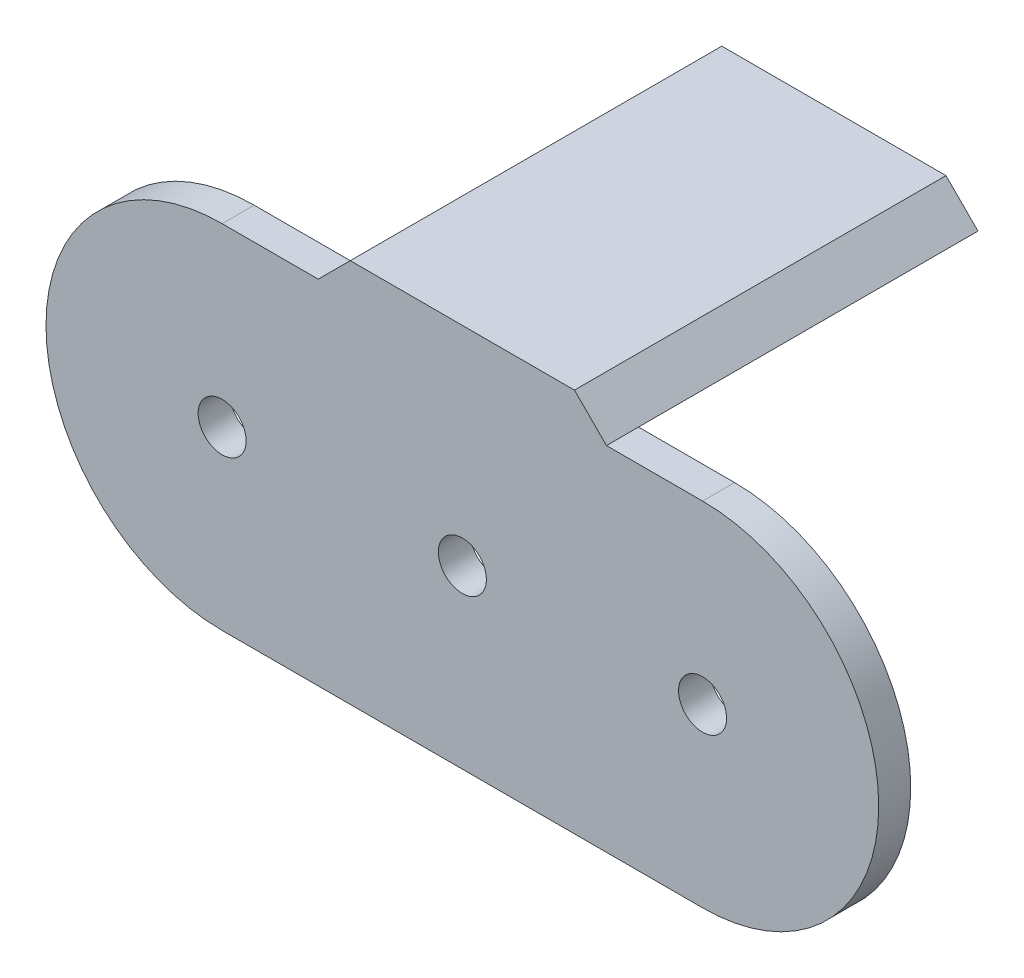
ISO-10303-21;
HEADER;
FILE_DESCRIPTION(('STEP AP214'),'2;1');
FILE_NAME('part.step','',(''),(''),'','','');
FILE_SCHEMA(('AUTOMOTIVE_DESIGN { 1 0 10303 214 1 1 1 1 }'));
ENDSEC;
DATA;
#1=APPLICATION_CONTEXT('core data for automotive mechanical design processes');
#2=APPLICATION_PROTOCOL_DEFINITION('international standard','automotive_design',2000,#1);
#3=PRODUCT_CONTEXT('',#1,'mechanical');
#4=PRODUCT('Part','Part','',(#3));
#5=PRODUCT_RELATED_PRODUCT_CATEGORY('part','',(#4));
#6=PRODUCT_DEFINITION_FORMATION('','',#4);
#7=PRODUCT_DEFINITION_CONTEXT('part definition',#1,'design');
#8=PRODUCT_DEFINITION('design','',#6,#7);
#9=PRODUCT_DEFINITION_SHAPE('','',#8);
#10=(LENGTH_UNIT() NAMED_UNIT(*) SI_UNIT(.MILLI.,.METRE.));
#11=(NAMED_UNIT(*) PLANE_ANGLE_UNIT() SI_UNIT($,.RADIAN.));
#12=(NAMED_UNIT(*) SI_UNIT($,.STERADIAN.) SOLID_ANGLE_UNIT());
#13=UNCERTAINTY_MEASURE_WITH_UNIT(LENGTH_MEASURE(1.E-05),#10,'distance_accuracy_value','');
#14=(GEOMETRIC_REPRESENTATION_CONTEXT(3) GLOBAL_UNCERTAINTY_ASSIGNED_CONTEXT((#13)) GLOBAL_UNIT_ASSIGNED_CONTEXT((#10,
#11,#12)) REPRESENTATION_CONTEXT('',''));
#15=CARTESIAN_POINT('',(0.,0.,0.));
#16=DIRECTION('',(0.,0.,1.));
#17=DIRECTION('',(1.,0.,0.));
#18=AXIS2_PLACEMENT_3D('',#15,#16,#17);
#19=CARTESIAN_POINT('',(-15.,11.,2.));
#20=DIRECTION('',(0.,-1.,0.));
#21=DIRECTION('',(1.,0.,0.));
#22=AXIS2_PLACEMENT_3D('',#19,#20,#21);
#23=PLANE('',#22);
#24=DIRECTION('',(0.,0.,-1.));
#25=VECTOR('',#24,1.);
#26=CARTESIAN_POINT('',(9.,11.,2.));
#27=LINE('',#26,#25);
#28=CARTESIAN_POINT('',(8.99999999999999,11.,2.));
#29=VERTEX_POINT('',#28);
#30=CARTESIAN_POINT('',(8.99999999999999,11.,0.));
#31=VERTEX_POINT('',#30);
#32=EDGE_CURVE('E132',#29,#31,#27,.T.);
#33=ORIENTED_EDGE('',*,*,#32,.F.);
#34=DIRECTION('',(-1.,0.,0.));
#35=VECTOR('',#34,1.);
#36=CARTESIAN_POINT('',(-15.,11.,2.));
#37=LINE('',#36,#35);
#38=CARTESIAN_POINT('',(15.,11.,2.));
#39=VERTEX_POINT('',#38);
#40=EDGE_CURVE('E181',#39,#29,#37,.T.);
#41=ORIENTED_EDGE('',*,*,#40,.F.);
#42=DIRECTION('',(0.,0.,-1.));
#43=VECTOR('',#42,1.);
#44=CARTESIAN_POINT('',(15.,11.,2.));
#45=LINE('',#44,#43);
#46=CARTESIAN_POINT('',(15.,11.,0.));
#47=VERTEX_POINT('',#46);
#48=EDGE_CURVE('E203',#39,#47,#45,.T.);
#49=ORIENTED_EDGE('',*,*,#48,.T.);
#50=DIRECTION('',(-1.,0.,0.));
#51=VECTOR('',#50,1.);
#52=CARTESIAN_POINT('',(-15.,11.,0.));
#53=LINE('',#52,#51);
#54=EDGE_CURVE('E174',#47,#31,#53,.T.);
#55=ORIENTED_EDGE('',*,*,#54,.T.);
#56=EDGE_LOOP('',(#33,#41,#49,#55));
#57=FACE_BOUND('',#56,.T.);
#58=ADVANCED_FACE('F47',(#57),#23,.F.);
#59=DIRECTION('',(0.,0.,1.));
#60=VECTOR('',#59,1.);
#61=CARTESIAN_POINT('',(-9.,11.,2.));
#62=LINE('',#61,#60);
#63=CARTESIAN_POINT('',(-9.,11.,0.));
#64=VERTEX_POINT('',#63);
#65=CARTESIAN_POINT('',(-9.,11.,2.));
#66=VERTEX_POINT('',#65);
#67=EDGE_CURVE('E215',#64,#66,#62,.T.);
#68=ORIENTED_EDGE('',*,*,#67,.F.);
#69=CARTESIAN_POINT('',(-15.,11.,0.));
#70=VERTEX_POINT('',#69);
#71=EDGE_CURVE('E195',#64,#70,#53,.T.);
#72=ORIENTED_EDGE('',*,*,#71,.T.);
#73=DIRECTION('',(0.,0.,-1.));
#74=VECTOR('',#73,1.);
#75=CARTESIAN_POINT('',(-15.,11.,2.));
#76=LINE('',#75,#74);
#77=CARTESIAN_POINT('',(-15.,11.,2.));
#78=VERTEX_POINT('',#77);
#79=EDGE_CURVE('E185',#78,#70,#76,.T.);
#80=ORIENTED_EDGE('',*,*,#79,.F.);
#81=EDGE_CURVE('E180',#66,#78,#37,.T.);
#82=ORIENTED_EDGE('',*,*,#81,.F.);
#83=EDGE_LOOP('',(#68,#72,#80,#82));
#84=FACE_BOUND('',#83,.T.);
#85=ADVANCED_FACE('F240',(#84),#23,.F.);
#86=CARTESIAN_POINT('',(-15.,0.,2.));
#87=DIRECTION('',(0.,0.,1.));
#88=DIRECTION('',(1.,0.,0.));
#89=AXIS2_PLACEMENT_3D('',#86,#87,#88);
#90=PLANE('',#89);
#91=CARTESIAN_POINT('',(15.,0.,2.));
#92=DIRECTION('',(0.,0.,1.));
#93=DIRECTION('',(1.,0.,0.));
#94=AXIS2_PLACEMENT_3D('',#91,#92,#93);
#95=CIRCLE('',#94,1.5);
#96=CARTESIAN_POINT('',(16.5,0.,2.));
#97=VERTEX_POINT('',#96);
#98=EDGE_CURVE('E153',#97,#97,#95,.T.);
#99=ORIENTED_EDGE('',*,*,#98,.F.);
#100=EDGE_LOOP('',(#99));
#101=FACE_BOUND('',#100,.T.);
#102=DIRECTION('',(1.,0.,0.));
#103=VECTOR('',#102,1.);
#104=CARTESIAN_POINT('',(9.,13.,2.));
#105=LINE('',#104,#103);
#106=CARTESIAN_POINT('',(-7.,13.,2.));
#107=VERTEX_POINT('',#106);
#108=CARTESIAN_POINT('',(7.,13.,2.));
#109=VERTEX_POINT('',#108);
#110=EDGE_CURVE('E143',#107,#109,#105,.T.);
#111=ORIENTED_EDGE('',*,*,#110,.F.);
#112=DIRECTION('',(0.707106781186546,0.707106781186549,0.));
#113=VECTOR('',#112,1.);
#114=CARTESIAN_POINT('',(-17.5,2.49999999999998,2.));
#115=LINE('',#114,#113);
#116=EDGE_CURVE('E122',#107,#66,#115,.F.);
#117=ORIENTED_EDGE('',*,*,#116,.T.);
#118=ORIENTED_EDGE('',*,*,#81,.T.);
#119=CARTESIAN_POINT('',(-15.,0.,2.));
#120=DIRECTION('',(0.,0.,1.));
#121=DIRECTION('',(1.,0.,0.));
#122=AXIS2_PLACEMENT_3D('',#119,#120,#121);
#123=CIRCLE('',#122,11.);
#124=CARTESIAN_POINT('',(-15.,-11.,2.));
#125=VERTEX_POINT('',#124);
#126=EDGE_CURVE('E169',#78,#125,#123,.T.);
#127=ORIENTED_EDGE('',*,*,#126,.T.);
#128=DIRECTION('',(1.,0.,0.));
#129=VECTOR('',#128,1.);
#130=CARTESIAN_POINT('',(-15.,-11.,2.));
#131=LINE('',#130,#129);
#132=CARTESIAN_POINT('',(15.,-11.,2.));
#133=VERTEX_POINT('',#132);
#134=EDGE_CURVE('E173',#125,#133,#131,.T.);
#135=ORIENTED_EDGE('',*,*,#134,.T.);
#136=CARTESIAN_POINT('',(15.,0.,2.));
#137=DIRECTION('',(0.,0.,1.));
#138=DIRECTION('',(1.,0.,0.));
#139=AXIS2_PLACEMENT_3D('',#136,#137,#138);
#140=CIRCLE('',#139,11.);
#141=EDGE_CURVE('E177',#133,#39,#140,.T.);
#142=ORIENTED_EDGE('',*,*,#141,.T.);
#143=ORIENTED_EDGE('',*,*,#40,.T.);
#144=DIRECTION('',(0.707106781186546,-0.707106781186549,0.));
#145=VECTOR('',#144,1.);
#146=CARTESIAN_POINT('',(2.50000000000004,17.5,2.));
#147=LINE('',#146,#145);
#148=EDGE_CURVE('E226',#29,#109,#147,.F.);
#149=ORIENTED_EDGE('',*,*,#148,.T.);
#150=EDGE_LOOP('',(#111,#117,#118,#127,#135,#142,#143,#149));
#151=FACE_BOUND('',#150,.T.);
#152=CARTESIAN_POINT('',(-15.,0.,2.));
#153=DIRECTION('',(0.,0.,1.));
#154=DIRECTION('',(1.,0.,0.));
#155=AXIS2_PLACEMENT_3D('',#152,#153,#154);
#156=CIRCLE('',#155,1.5);
#157=CARTESIAN_POINT('',(-13.5,0.,2.));
#158=VERTEX_POINT('',#157);
#159=EDGE_CURVE('E161',#158,#158,#156,.T.);
#160=ORIENTED_EDGE('',*,*,#159,.F.);
#161=EDGE_LOOP('',(#160));
#162=FACE_BOUND('',#161,.T.);
#163=CARTESIAN_POINT('',(0.,0.,2.));
#164=DIRECTION('',(0.,0.,1.));
#165=DIRECTION('',(1.,0.,0.));
#166=AXIS2_PLACEMENT_3D('',#163,#164,#165);
#167=CIRCLE('',#166,1.5);
#168=CARTESIAN_POINT('',(1.5,0.,2.));
#169=VERTEX_POINT('',#168);
#170=EDGE_CURVE('E144',#169,#169,#167,.T.);
#171=ORIENTED_EDGE('',*,*,#170,.F.);
#172=EDGE_LOOP('',(#171));
#173=FACE_BOUND('',#172,.T.);
#174=ADVANCED_FACE('F233',(#101,#151,#162,#173),#90,.T.);
#175=CARTESIAN_POINT('',(-15.,0.,0.));
#176=DIRECTION('',(0.,0.,1.));
#177=DIRECTION('',(1.,0.,0.));
#178=AXIS2_PLACEMENT_3D('',#175,#176,#177);
#179=PLANE('',#178);
#180=CARTESIAN_POINT('',(-15.,0.,0.));
#181=DIRECTION('',(0.,0.,1.));
#182=DIRECTION('',(1.,0.,0.));
#183=AXIS2_PLACEMENT_3D('',#180,#181,#182);
#184=CIRCLE('',#183,11.);
#185=CARTESIAN_POINT('',(-15.,-11.,0.));
#186=VERTEX_POINT('',#185);
#187=EDGE_CURVE('E165',#70,#186,#184,.T.);
#188=ORIENTED_EDGE('',*,*,#187,.F.);
#189=ORIENTED_EDGE('',*,*,#71,.F.);
#190=EDGE_CURVE('E199',#31,#64,#53,.T.);
#191=ORIENTED_EDGE('',*,*,#190,.F.);
#192=ORIENTED_EDGE('',*,*,#54,.F.);
#193=CARTESIAN_POINT('',(15.,0.,0.));
#194=DIRECTION('',(0.,0.,1.));
#195=DIRECTION('',(1.,0.,0.));
#196=AXIS2_PLACEMENT_3D('',#193,#194,#195);
#197=CIRCLE('',#196,11.);
#198=CARTESIAN_POINT('',(15.,-11.,0.));
#199=VERTEX_POINT('',#198);
#200=EDGE_CURVE('E192',#199,#47,#197,.T.);
#201=ORIENTED_EDGE('',*,*,#200,.F.);
#202=DIRECTION('',(1.,0.,0.));
#203=VECTOR('',#202,1.);
#204=CARTESIAN_POINT('',(-15.,-11.,0.));
#205=LINE('',#204,#203);
#206=EDGE_CURVE('E189',#186,#199,#205,.T.);
#207=ORIENTED_EDGE('',*,*,#206,.F.);
#208=EDGE_LOOP('',(#188,#189,#191,#192,#201,#207));
#209=FACE_BOUND('',#208,.T.);
#210=CARTESIAN_POINT('',(-15.,0.,0.));
#211=DIRECTION('',(0.,0.,1.));
#212=DIRECTION('',(1.,0.,0.));
#213=AXIS2_PLACEMENT_3D('',#210,#211,#212);
#214=CIRCLE('',#213,1.5);
#215=CARTESIAN_POINT('',(-13.5,0.,0.));
#216=VERTEX_POINT('',#215);
#217=EDGE_CURVE('E157',#216,#216,#214,.T.);
#218=ORIENTED_EDGE('',*,*,#217,.T.);
#219=EDGE_LOOP('',(#218));
#220=FACE_BOUND('',#219,.T.);
#221=CARTESIAN_POINT('',(15.,0.,0.));
#222=DIRECTION('',(0.,0.,1.));
#223=DIRECTION('',(1.,0.,0.));
#224=AXIS2_PLACEMENT_3D('',#221,#222,#223);
#225=CIRCLE('',#224,1.5);
#226=CARTESIAN_POINT('',(16.5,0.,0.));
#227=VERTEX_POINT('',#226);
#228=EDGE_CURVE('E148',#227,#227,#225,.T.);
#229=ORIENTED_EDGE('',*,*,#228,.T.);
#230=EDGE_LOOP('',(#229));
#231=FACE_BOUND('',#230,.T.);
#232=CARTESIAN_POINT('',(0.,0.,0.));
#233=DIRECTION('',(0.,0.,1.));
#234=DIRECTION('',(1.,0.,0.));
#235=AXIS2_PLACEMENT_3D('',#232,#233,#234);
#236=CIRCLE('',#235,1.5);
#237=CARTESIAN_POINT('',(1.5,0.,0.));
#238=VERTEX_POINT('',#237);
#239=EDGE_CURVE('E149',#238,#238,#236,.T.);
#240=ORIENTED_EDGE('',*,*,#239,.T.);
#241=EDGE_LOOP('',(#240));
#242=FACE_BOUND('',#241,.T.);
#243=ADVANCED_FACE('F254',(#209,#220,#231,#242),#179,.F.);
#244=CARTESIAN_POINT('',(-15.,0.,2.));
#245=DIRECTION('',(0.,0.,-1.));
#246=DIRECTION('',(-1.,0.,0.));
#247=AXIS2_PLACEMENT_3D('',#244,#245,#246);
#248=CYLINDRICAL_SURFACE('',#247,11.);
#249=ORIENTED_EDGE('',*,*,#187,.T.);
#250=DIRECTION('',(0.,0.,-1.));
#251=VECTOR('',#250,1.);
#252=CARTESIAN_POINT('',(-15.,-11.,2.));
#253=LINE('',#252,#251);
#254=EDGE_CURVE('E211',#125,#186,#253,.T.);
#255=ORIENTED_EDGE('',*,*,#254,.F.);
#256=ORIENTED_EDGE('',*,*,#126,.F.);
#257=ORIENTED_EDGE('',*,*,#79,.T.);
#258=EDGE_LOOP('',(#249,#255,#256,#257));
#259=FACE_BOUND('',#258,.T.);
#260=ADVANCED_FACE('F268',(#259),#248,.T.);
#261=CARTESIAN_POINT('',(-15.,-11.,2.));
#262=DIRECTION('',(0.,1.,0.));
#263=DIRECTION('',(-1.,0.,0.));
#264=AXIS2_PLACEMENT_3D('',#261,#262,#263);
#265=PLANE('',#264);
#266=ORIENTED_EDGE('',*,*,#206,.T.);
#267=DIRECTION('',(0.,0.,-1.));
#268=VECTOR('',#267,1.);
#269=CARTESIAN_POINT('',(15.,-11.,2.));
#270=LINE('',#269,#268);
#271=EDGE_CURVE('E207',#133,#199,#270,.T.);
#272=ORIENTED_EDGE('',*,*,#271,.F.);
#273=ORIENTED_EDGE('',*,*,#134,.F.);
#274=ORIENTED_EDGE('',*,*,#254,.T.);
#275=EDGE_LOOP('',(#266,#272,#273,#274));
#276=FACE_BOUND('',#275,.T.);
#277=ADVANCED_FACE('F266',(#276),#265,.F.);
#278=CARTESIAN_POINT('',(15.,0.,2.));
#279=DIRECTION('',(0.,0.,-1.));
#280=DIRECTION('',(-1.,0.,0.));
#281=AXIS2_PLACEMENT_3D('',#278,#279,#280);
#282=CYLINDRICAL_SURFACE('',#281,11.);
#283=ORIENTED_EDGE('',*,*,#200,.T.);
#284=ORIENTED_EDGE('',*,*,#48,.F.);
#285=ORIENTED_EDGE('',*,*,#141,.F.);
#286=ORIENTED_EDGE('',*,*,#271,.T.);
#287=EDGE_LOOP('',(#283,#284,#285,#286));
#288=FACE_BOUND('',#287,.T.);
#289=ADVANCED_FACE('F262',(#288),#282,.T.);
#290=CARTESIAN_POINT('',(-15.,0.,2.));
#291=DIRECTION('',(0.,0.,-1.));
#292=DIRECTION('',(-1.,0.,0.));
#293=AXIS2_PLACEMENT_3D('',#290,#291,#292);
#294=CYLINDRICAL_SURFACE('',#293,1.5);
#295=ORIENTED_EDGE('',*,*,#159,.T.);
#296=EDGE_LOOP('',(#295));
#297=FACE_BOUND('',#296,.T.);
#298=ORIENTED_EDGE('',*,*,#217,.F.);
#299=EDGE_LOOP('',(#298));
#300=FACE_BOUND('',#299,.T.);
#301=ADVANCED_FACE('F286',(#297,#300),#294,.F.);
#302=CARTESIAN_POINT('',(15.,0.,2.));
#303=DIRECTION('',(0.,0.,-1.));
#304=DIRECTION('',(-1.,0.,0.));
#305=AXIS2_PLACEMENT_3D('',#302,#303,#304);
#306=CYLINDRICAL_SURFACE('',#305,1.5);
#307=ORIENTED_EDGE('',*,*,#98,.T.);
#308=EDGE_LOOP('',(#307));
#309=FACE_BOUND('',#308,.T.);
#310=ORIENTED_EDGE('',*,*,#228,.F.);
#311=EDGE_LOOP('',(#310));
#312=FACE_BOUND('',#311,.T.);
#313=ADVANCED_FACE('F290',(#309,#312),#306,.F.);
#314=CARTESIAN_POINT('',(0.,0.,2.));
#315=DIRECTION('',(0.,0.,-1.));
#316=DIRECTION('',(-1.,0.,0.));
#317=AXIS2_PLACEMENT_3D('',#314,#315,#316);
#318=CYLINDRICAL_SURFACE('',#317,1.5);
#319=ORIENTED_EDGE('',*,*,#170,.T.);
#320=EDGE_LOOP('',(#319));
#321=FACE_BOUND('',#320,.T.);
#322=ORIENTED_EDGE('',*,*,#239,.F.);
#323=EDGE_LOOP('',(#322));
#324=FACE_BOUND('',#323,.T.);
#325=ADVANCED_FACE('F296',(#321,#324),#318,.F.);
#326=CARTESIAN_POINT('',(0.,11.,0.));
#327=DIRECTION('',(0.,-1.,0.));
#328=DIRECTION('',(0.,0.,-1.));
#329=AXIS2_PLACEMENT_3D('',#326,#327,#328);
#330=PLANE('',#329);
#331=ORIENTED_EDGE('',*,*,#190,.T.);
#332=DIRECTION('',(0.,0.,1.));
#333=VECTOR('',#332,1.);
#334=CARTESIAN_POINT('',(-9.,11.,2.));
#335=LINE('',#334,#333);
#336=CARTESIAN_POINT('',(-9.,11.,-21.2));
#337=VERTEX_POINT('',#336);
#338=EDGE_CURVE('E130',#337,#64,#335,.T.);
#339=ORIENTED_EDGE('',*,*,#338,.F.);
#340=DIRECTION('',(-1.,0.,0.));
#341=VECTOR('',#340,1.);
#342=CARTESIAN_POINT('',(9.,11.,-21.2));
#343=LINE('',#342,#341);
#344=CARTESIAN_POINT('',(9.,11.,-21.2));
#345=VERTEX_POINT('',#344);
#346=EDGE_CURVE('E118',#345,#337,#343,.T.);
#347=ORIENTED_EDGE('',*,*,#346,.F.);
#348=EDGE_CURVE('E127',#31,#345,#27,.T.);
#349=ORIENTED_EDGE('',*,*,#348,.F.);
#350=EDGE_LOOP('',(#331,#339,#347,#349));
#351=FACE_BOUND('',#350,.T.);
#352=ADVANCED_FACE('F126',(#351),#330,.T.);
#353=CARTESIAN_POINT('',(9.,13.,-21.2));
#354=DIRECTION('',(0.,0.,1.));
#355=DIRECTION('',(1.,0.,0.));
#356=AXIS2_PLACEMENT_3D('',#353,#354,#355);
#357=PLANE('',#356);
#358=ORIENTED_EDGE('',*,*,#346,.T.);
#359=DIRECTION('',(-0.707106781186546,-0.707106781186549,0.));
#360=VECTOR('',#359,1.);
#361=CARTESIAN_POINT('',(-7.,13.,-21.2));
#362=LINE('',#361,#360);
#363=CARTESIAN_POINT('',(-7.,13.,-21.2));
#364=VERTEX_POINT('',#363);
#365=EDGE_CURVE('E11',#337,#364,#362,.F.);
#366=ORIENTED_EDGE('',*,*,#365,.T.);
#367=DIRECTION('',(-1.,0.,0.));
#368=VECTOR('',#367,1.);
#369=CARTESIAN_POINT('',(9.,13.,-21.2));
#370=LINE('',#369,#368);
#371=CARTESIAN_POINT('',(7.00000000000001,13.,-21.2));
#372=VERTEX_POINT('',#371);
#373=EDGE_CURVE('E120',#372,#364,#370,.T.);
#374=ORIENTED_EDGE('',*,*,#373,.F.);
#375=DIRECTION('',(-0.707106781186546,0.707106781186549,0.));
#376=VECTOR('',#375,1.);
#377=CARTESIAN_POINT('',(7.00000000000001,13.,-21.2));
#378=LINE('',#377,#376);
#379=EDGE_CURVE('E57',#372,#345,#378,.F.);
#380=ORIENTED_EDGE('',*,*,#379,.T.);
#381=EDGE_LOOP('',(#358,#366,#374,#380));
#382=FACE_BOUND('',#381,.T.);
#383=ADVANCED_FACE('F117',(#382),#357,.F.);
#384=CARTESIAN_POINT('',(0.,13.,0.));
#385=DIRECTION('',(0.,-1.,0.));
#386=DIRECTION('',(0.,0.,-1.));
#387=AXIS2_PLACEMENT_3D('',#384,#385,#386);
#388=PLANE('',#387);
#389=ORIENTED_EDGE('',*,*,#373,.T.);
#390=DIRECTION('',(0.,0.,1.));
#391=VECTOR('',#390,1.);
#392=CARTESIAN_POINT('',(-7.,13.,0.));
#393=LINE('',#392,#391);
#394=EDGE_CURVE('E222',#364,#107,#393,.T.);
#395=ORIENTED_EDGE('',*,*,#394,.T.);
#396=ORIENTED_EDGE('',*,*,#110,.T.);
#397=DIRECTION('',(0.,0.,-1.));
#398=VECTOR('',#397,1.);
#399=CARTESIAN_POINT('',(7.,13.,0.));
#400=LINE('',#399,#398);
#401=EDGE_CURVE('E219',#109,#372,#400,.T.);
#402=ORIENTED_EDGE('',*,*,#401,.T.);
#403=EDGE_LOOP('',(#389,#395,#396,#402));
#404=FACE_BOUND('',#403,.T.);
#405=ADVANCED_FACE('F246',(#404),#388,.F.);
#406=CARTESIAN_POINT('',(-7.,13.,0.));
#407=DIRECTION('',(0.707106781186549,-0.707106781186546,0.));
#408=DIRECTION('',(0.,0.,1.));
#409=AXIS2_PLACEMENT_3D('',#406,#407,#408);
#410=PLANE('',#409);
#411=ORIENTED_EDGE('',*,*,#338,.T.);
#412=ORIENTED_EDGE('',*,*,#67,.T.);
#413=ORIENTED_EDGE('',*,*,#116,.F.);
#414=ORIENTED_EDGE('',*,*,#394,.F.);
#415=ORIENTED_EDGE('',*,*,#365,.F.);
#416=EDGE_LOOP('',(#411,#412,#413,#414,#415));
#417=FACE_BOUND('',#416,.T.);
#418=ADVANCED_FACE('F244',(#417),#410,.F.);
#419=CARTESIAN_POINT('',(7.,13.,0.));
#420=DIRECTION('',(-0.707106781186549,-0.707106781186546,0.));
#421=DIRECTION('',(0.,0.,-1.));
#422=AXIS2_PLACEMENT_3D('',#419,#420,#421);
#423=PLANE('',#422);
#424=ORIENTED_EDGE('',*,*,#32,.T.);
#425=ORIENTED_EDGE('',*,*,#348,.T.);
#426=ORIENTED_EDGE('',*,*,#379,.F.);
#427=ORIENTED_EDGE('',*,*,#401,.F.);
#428=ORIENTED_EDGE('',*,*,#148,.F.);
#429=EDGE_LOOP('',(#424,#425,#426,#427,#428));
#430=FACE_BOUND('',#429,.T.);
#431=ADVANCED_FACE('F50',(#430),#423,.F.);
#432=CLOSED_SHELL('',(#58,#85,#174,#243,#260,#277,#289,#301,#313,#325,#352,#383,#405,#418,#431));
#433=MANIFOLD_SOLID_BREP('B2',#432);
#434=ADVANCED_BREP_SHAPE_REPRESENTATION('',(#18,#433),#14);
#435=SHAPE_DEFINITION_REPRESENTATION(#9,#434);
ENDSEC;
END-ISO-10303-21;
